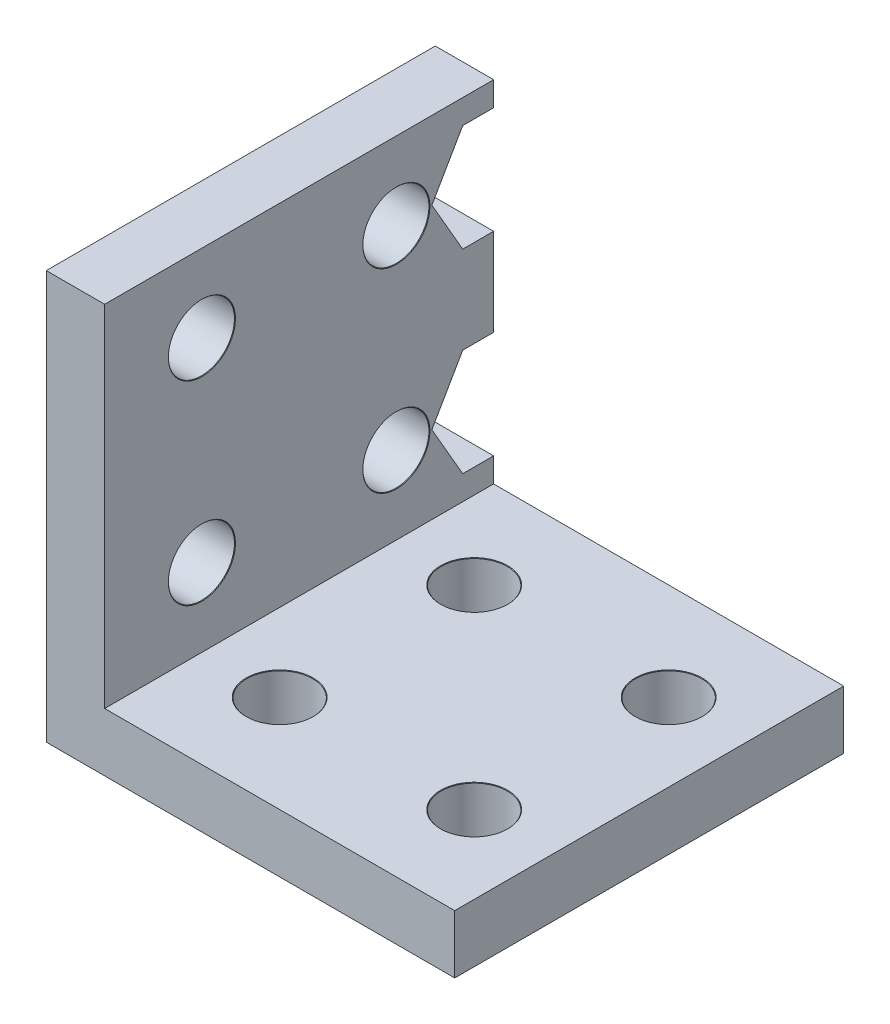
ISO-10303-21;
HEADER;
FILE_DESCRIPTION(('STEP AP214'),'2;1');
FILE_NAME('part.step','',(''),(''),'','','');
FILE_SCHEMA(('AUTOMOTIVE_DESIGN { 1 0 10303 214 1 1 1 1 }'));
ENDSEC;
DATA;
#1=APPLICATION_CONTEXT('core data for automotive mechanical design processes');
#2=APPLICATION_PROTOCOL_DEFINITION('international standard','automotive_design',2000,#1);
#3=PRODUCT_CONTEXT('',#1,'mechanical');
#4=PRODUCT('Part','Part','',(#3));
#5=PRODUCT_RELATED_PRODUCT_CATEGORY('part','',(#4));
#6=PRODUCT_DEFINITION_FORMATION('','',#4);
#7=PRODUCT_DEFINITION_CONTEXT('part definition',#1,'design');
#8=PRODUCT_DEFINITION('design','',#6,#7);
#9=PRODUCT_DEFINITION_SHAPE('','',#8);
#10=(LENGTH_UNIT() NAMED_UNIT(*) SI_UNIT(.MILLI.,.METRE.));
#11=(NAMED_UNIT(*) PLANE_ANGLE_UNIT() SI_UNIT($,.RADIAN.));
#12=(NAMED_UNIT(*) SI_UNIT($,.STERADIAN.) SOLID_ANGLE_UNIT());
#13=UNCERTAINTY_MEASURE_WITH_UNIT(LENGTH_MEASURE(1.E-05),#10,'distance_accuracy_value','');
#14=(GEOMETRIC_REPRESENTATION_CONTEXT(3) GLOBAL_UNCERTAINTY_ASSIGNED_CONTEXT((#13)) GLOBAL_UNIT_ASSIGNED_CONTEXT((#10,
#11,#12)) REPRESENTATION_CONTEXT('',''));
#15=CARTESIAN_POINT('',(0.,0.,0.));
#16=DIRECTION('',(0.,0.,1.));
#17=DIRECTION('',(1.,0.,0.));
#18=AXIS2_PLACEMENT_3D('',#15,#16,#17);
#19=CARTESIAN_POINT('',(0.,0.,0.));
#20=DIRECTION('',(0.,0.,1.));
#21=DIRECTION('',(1.,0.,0.));
#22=AXIS2_PLACEMENT_3D('',#19,#20,#21);
#23=PLANE('',#22);
#24=DIRECTION('',(0.,-1.,0.));
#25=VECTOR('',#24,1.);
#26=CARTESIAN_POINT('',(0.,21.,0.));
#27=LINE('',#26,#25);
#28=CARTESIAN_POINT('',(0.,4.24999999996839,0.));
#29=VERTEX_POINT('',#28);
#30=CARTESIAN_POINT('',(0.,0.,0.));
#31=VERTEX_POINT('',#30);
#32=EDGE_CURVE('E228',#29,#31,#27,.T.);
#33=ORIENTED_EDGE('',*,*,#32,.F.);
#34=DIRECTION('',(1.,0.,0.));
#35=VECTOR('',#34,1.);
#36=CARTESIAN_POINT('',(-6.3508529611243,4.24999999996839,0.));
#37=LINE('',#36,#35);
#38=CARTESIAN_POINT('',(3.,4.24999999996839,0.));
#39=VERTEX_POINT('',#38);
#40=EDGE_CURVE('E407',#29,#39,#37,.T.);
#41=ORIENTED_EDGE('',*,*,#40,.T.);
#42=DIRECTION('',(0.,1.,0.));
#43=VECTOR('',#42,1.);
#44=CARTESIAN_POINT('',(3.,3.,0.));
#45=LINE('',#44,#43);
#46=CARTESIAN_POINT('',(3.,3.,0.));
#47=VERTEX_POINT('',#46);
#48=EDGE_CURVE('E187',#47,#39,#45,.T.);
#49=ORIENTED_EDGE('',*,*,#48,.F.);
#50=DIRECTION('',(-1.,0.,0.));
#51=VECTOR('',#50,1.);
#52=CARTESIAN_POINT('',(21.,3.,0.));
#53=LINE('',#52,#51);
#54=CARTESIAN_POINT('',(21.,3.,0.));
#55=VERTEX_POINT('',#54);
#56=EDGE_CURVE('E193',#55,#47,#53,.T.);
#57=ORIENTED_EDGE('',*,*,#56,.F.);
#58=DIRECTION('',(0.,1.,0.));
#59=VECTOR('',#58,1.);
#60=CARTESIAN_POINT('',(21.,0.,0.));
#61=LINE('',#60,#59);
#62=CARTESIAN_POINT('',(21.,0.,0.));
#63=VERTEX_POINT('',#62);
#64=EDGE_CURVE('E230',#63,#55,#61,.T.);
#65=ORIENTED_EDGE('',*,*,#64,.F.);
#66=DIRECTION('',(1.,0.,0.));
#67=VECTOR('',#66,1.);
#68=CARTESIAN_POINT('',(0.,0.,0.));
#69=LINE('',#68,#67);
#70=EDGE_CURVE('E221',#31,#63,#69,.T.);
#71=ORIENTED_EDGE('',*,*,#70,.F.);
#72=EDGE_LOOP('',(#33,#41,#49,#57,#65,#71));
#73=FACE_BOUND('',#72,.T.);
#74=ADVANCED_FACE('F45',(#73),#23,.F.);
#75=CARTESIAN_POINT('',(3.,9.74999999996839,0.));
#76=VERTEX_POINT('',#75);
#77=CARTESIAN_POINT('',(3.,14.2499999999684,0.));
#78=VERTEX_POINT('',#77);
#79=EDGE_CURVE('E177',#76,#78,#45,.T.);
#80=ORIENTED_EDGE('',*,*,#79,.F.);
#81=DIRECTION('',(1.,0.,0.));
#82=VECTOR('',#81,1.);
#83=CARTESIAN_POINT('',(-6.3508529611243,9.74999999996839,0.));
#84=LINE('',#83,#82);
#85=CARTESIAN_POINT('',(0.,9.74999999996839,0.));
#86=VERTEX_POINT('',#85);
#87=EDGE_CURVE('E159',#86,#76,#84,.T.);
#88=ORIENTED_EDGE('',*,*,#87,.F.);
#89=CARTESIAN_POINT('',(0.,14.2499999999684,0.));
#90=VERTEX_POINT('',#89);
#91=EDGE_CURVE('E237',#90,#86,#27,.T.);
#92=ORIENTED_EDGE('',*,*,#91,.F.);
#93=DIRECTION('',(1.,0.,0.));
#94=VECTOR('',#93,1.);
#95=CARTESIAN_POINT('',(-6.3508529611243,14.2499999999684,0.));
#96=LINE('',#95,#94);
#97=EDGE_CURVE('E185',#90,#78,#96,.T.);
#98=ORIENTED_EDGE('',*,*,#97,.T.);
#99=EDGE_LOOP('',(#80,#88,#92,#98));
#100=FACE_BOUND('',#99,.T.);
#101=ADVANCED_FACE('F184',(#100),#23,.F.);
#102=CARTESIAN_POINT('',(2.99999999999999,21.,20.));
#103=DIRECTION('',(0.,-1.,0.));
#104=DIRECTION('',(0.,0.,-1.));
#105=AXIS2_PLACEMENT_3D('',#102,#103,#104);
#106=PLANE('',#105);
#107=DIRECTION('',(-1.,0.,0.));
#108=VECTOR('',#107,1.);
#109=CARTESIAN_POINT('',(2.99999999999999,21.,0.));
#110=LINE('',#109,#108);
#111=CARTESIAN_POINT('',(2.99999999999999,21.,0.));
#112=VERTEX_POINT('',#111);
#113=CARTESIAN_POINT('',(0.,21.,0.));
#114=VERTEX_POINT('',#113);
#115=EDGE_CURVE('E240',#112,#114,#110,.T.);
#116=ORIENTED_EDGE('',*,*,#115,.T.);
#117=DIRECTION('',(0.,0.,-1.));
#118=VECTOR('',#117,1.);
#119=CARTESIAN_POINT('',(0.,21.,20.));
#120=LINE('',#119,#118);
#121=CARTESIAN_POINT('',(0.,21.,20.));
#122=VERTEX_POINT('',#121);
#123=EDGE_CURVE('E11',#122,#114,#120,.T.);
#124=ORIENTED_EDGE('',*,*,#123,.F.);
#125=DIRECTION('',(-1.,0.,0.));
#126=VECTOR('',#125,1.);
#127=CARTESIAN_POINT('',(2.99999999999999,21.,20.));
#128=LINE('',#127,#126);
#129=CARTESIAN_POINT('',(2.99999999999999,21.,20.));
#130=VERTEX_POINT('',#129);
#131=EDGE_CURVE('E192',#130,#122,#128,.T.);
#132=ORIENTED_EDGE('',*,*,#131,.F.);
#133=DIRECTION('',(0.,0.,-1.));
#134=VECTOR('',#133,1.);
#135=CARTESIAN_POINT('',(2.99999999999999,21.,20.));
#136=LINE('',#135,#134);
#137=EDGE_CURVE('E197',#130,#112,#136,.T.);
#138=ORIENTED_EDGE('',*,*,#137,.T.);
#139=EDGE_LOOP('',(#116,#124,#132,#138));
#140=FACE_BOUND('',#139,.T.);
#141=ADVANCED_FACE('F47',(#140),#106,.F.);
#142=CARTESIAN_POINT('',(0.,21.,20.));
#143=DIRECTION('',(1.,0.,0.));
#144=DIRECTION('',(0.,1.,0.));
#145=AXIS2_PLACEMENT_3D('',#142,#143,#144);
#146=PLANE('',#145);
#147=CARTESIAN_POINT('',(0.,7.,15.));
#148=DIRECTION('',(1.,0.,0.));
#149=DIRECTION('',(0.,0.,-1.));
#150=AXIS2_PLACEMENT_3D('',#147,#148,#149);
#151=CIRCLE('',#150,1.7);
#152=CARTESIAN_POINT('',(0.,7.,13.3));
#153=VERTEX_POINT('',#152);
#154=EDGE_CURVE('E344',#153,#153,#151,.T.);
#155=ORIENTED_EDGE('',*,*,#154,.T.);
#156=EDGE_LOOP('',(#155));
#157=FACE_BOUND('',#156,.T.);
#158=CARTESIAN_POINT('',(0.,7.,5.));
#159=DIRECTION('',(1.,0.,0.));
#160=DIRECTION('',(0.,0.,-1.));
#161=AXIS2_PLACEMENT_3D('',#158,#159,#160);
#162=CIRCLE('',#161,1.7);
#163=CARTESIAN_POINT('',(0.,7.,3.3));
#164=VERTEX_POINT('',#163);
#165=EDGE_CURVE('E332',#164,#164,#162,.T.);
#166=ORIENTED_EDGE('',*,*,#165,.T.);
#167=EDGE_LOOP('',(#166));
#168=FACE_BOUND('',#167,.T.);
#169=CARTESIAN_POINT('',(0.,17.,5.));
#170=DIRECTION('',(1.,0.,0.));
#171=DIRECTION('',(0.,0.,-1.));
#172=AXIS2_PLACEMENT_3D('',#169,#170,#171);
#173=CIRCLE('',#172,1.7);
#174=CARTESIAN_POINT('',(0.,17.,3.3));
#175=VERTEX_POINT('',#174);
#176=EDGE_CURVE('E320',#175,#175,#173,.T.);
#177=ORIENTED_EDGE('',*,*,#176,.T.);
#178=EDGE_LOOP('',(#177));
#179=FACE_BOUND('',#178,.T.);
#180=CARTESIAN_POINT('',(0.,17.,15.));
#181=DIRECTION('',(1.,0.,0.));
#182=DIRECTION('',(0.,0.,-1.));
#183=AXIS2_PLACEMENT_3D('',#180,#181,#182);
#184=CIRCLE('',#183,1.7);
#185=CARTESIAN_POINT('',(0.,17.,13.3));
#186=VERTEX_POINT('',#185);
#187=EDGE_CURVE('E308',#186,#186,#184,.T.);
#188=ORIENTED_EDGE('',*,*,#187,.T.);
#189=EDGE_LOOP('',(#188));
#190=FACE_BOUND('',#189,.T.);
#191=DIRECTION('',(0.,0.866025403784439,0.5));
#192=VECTOR('',#191,1.);
#193=CARTESIAN_POINT('',(0.,0.374999999960671,-0.649519052770208));
#194=LINE('',#193,#192);
#195=CARTESIAN_POINT('',(0.,4.24999999996839,1.58771324034405));
#196=VERTEX_POINT('',#195);
#197=CARTESIAN_POINT('',(0.,6.99999999996839,3.17542648061552));
#198=VERTEX_POINT('',#197);
#199=EDGE_CURVE('E421',#196,#198,#194,.T.);
#200=ORIENTED_EDGE('',*,*,#199,.F.);
#201=DIRECTION('',(0.,0.,1.));
#202=VECTOR('',#201,1.);
#203=CARTESIAN_POINT('',(0.,4.24999999996839,0.));
#204=LINE('',#203,#202);
#205=EDGE_CURVE('E397',#29,#196,#204,.T.);
#206=ORIENTED_EDGE('',*,*,#205,.F.);
#207=ORIENTED_EDGE('',*,*,#32,.T.);
#208=DIRECTION('',(0.,0.,-1.));
#209=VECTOR('',#208,1.);
#210=CARTESIAN_POINT('',(0.,0.,20.));
#211=LINE('',#210,#209);
#212=CARTESIAN_POINT('',(0.,0.,20.));
#213=VERTEX_POINT('',#212);
#214=EDGE_CURVE('E54',#213,#31,#211,.T.);
#215=ORIENTED_EDGE('',*,*,#214,.F.);
#216=DIRECTION('',(0.,-1.,0.));
#217=VECTOR('',#216,1.);
#218=CARTESIAN_POINT('',(0.,21.,20.));
#219=LINE('',#218,#217);
#220=EDGE_CURVE('E255',#122,#213,#219,.T.);
#221=ORIENTED_EDGE('',*,*,#220,.F.);
#222=ORIENTED_EDGE('',*,*,#123,.T.);
#223=CARTESIAN_POINT('',(0.,19.7499999999684,0.));
#224=VERTEX_POINT('',#223);
#225=EDGE_CURVE('E232',#114,#224,#27,.T.);
#226=ORIENTED_EDGE('',*,*,#225,.T.);
#227=DIRECTION('',(0.,0.,-1.));
#228=VECTOR('',#227,1.);
#229=CARTESIAN_POINT('',(0.,19.7499999999684,0.));
#230=LINE('',#229,#228);
#231=CARTESIAN_POINT('',(0.,19.7499999999684,1.5877132403483));
#232=VERTEX_POINT('',#231);
#233=EDGE_CURVE('E69',#232,#224,#230,.T.);
#234=ORIENTED_EDGE('',*,*,#233,.F.);
#235=DIRECTION('',(0.,0.866025403784439,-0.5));
#236=VECTOR('',#235,1.);
#237=CARTESIAN_POINT('',(0.,5.62500000002536,9.74278579261887));
#238=LINE('',#237,#236);
#239=CARTESIAN_POINT('',(0.,16.9999999999684,3.17542648061977));
#240=VERTEX_POINT('',#239);
#241=EDGE_CURVE('E374',#240,#232,#238,.T.);
#242=ORIENTED_EDGE('',*,*,#241,.F.);
#243=DIRECTION('',(0.,0.866025403784438,0.500000000000001));
#244=VECTOR('',#243,1.);
#245=CARTESIAN_POINT('',(0.,2.87499999995884,-4.97964607168923));
#246=LINE('',#245,#244);
#247=CARTESIAN_POINT('',(0.,14.2499999999684,1.5877132403483));
#248=VERTEX_POINT('',#247);
#249=EDGE_CURVE('E391',#248,#240,#246,.T.);
#250=ORIENTED_EDGE('',*,*,#249,.F.);
#251=DIRECTION('',(0.,0.,1.));
#252=VECTOR('',#251,1.);
#253=CARTESIAN_POINT('',(0.,14.2499999999684,0.));
#254=LINE('',#253,#252);
#255=EDGE_CURVE('E358',#90,#248,#254,.T.);
#256=ORIENTED_EDGE('',*,*,#255,.F.);
#257=ORIENTED_EDGE('',*,*,#91,.T.);
#258=DIRECTION('',(0.,0.,-1.));
#259=VECTOR('',#258,1.);
#260=CARTESIAN_POINT('',(0.,9.74999999996839,0.));
#261=LINE('',#260,#259);
#262=CARTESIAN_POINT('',(0.,9.74999999996839,1.58771324034405));
#263=VERTEX_POINT('',#262);
#264=EDGE_CURVE('E61',#263,#86,#261,.T.);
#265=ORIENTED_EDGE('',*,*,#264,.F.);
#266=DIRECTION('',(0.,0.866025403784439,-0.5));
#267=VECTOR('',#266,1.);
#268=CARTESIAN_POINT('',(0.,3.12500000002352,5.41265877369349));
#269=LINE('',#268,#267);
#270=EDGE_CURVE('E410',#198,#263,#269,.T.);
#271=ORIENTED_EDGE('',*,*,#270,.F.);
#272=EDGE_LOOP('',(#200,#206,#207,#215,#221,#222,#226,#234,#242,#250,#256,#257,#265,#271));
#273=FACE_BOUND('',#272,.T.);
#274=ADVANCED_FACE('F430',(#157,#168,#179,#190,#273),#146,.F.);
#275=CARTESIAN_POINT('',(0.,0.,20.));
#276=DIRECTION('',(0.,1.,0.));
#277=DIRECTION('',(0.,0.,1.));
#278=AXIS2_PLACEMENT_3D('',#275,#276,#277);
#279=PLANE('',#278);
#280=CARTESIAN_POINT('',(7.,0.,5.));
#281=DIRECTION('',(0.,1.,0.));
#282=DIRECTION('',(0.,0.,1.));
#283=AXIS2_PLACEMENT_3D('',#280,#281,#282);
#284=CIRCLE('',#283,1.7);
#285=CARTESIAN_POINT('',(7.,0.,6.7));
#286=VERTEX_POINT('',#285);
#287=EDGE_CURVE('E296',#286,#286,#284,.T.);
#288=ORIENTED_EDGE('',*,*,#287,.T.);
#289=EDGE_LOOP('',(#288));
#290=FACE_BOUND('',#289,.T.);
#291=CARTESIAN_POINT('',(17.,0.,5.));
#292=DIRECTION('',(0.,1.,0.));
#293=DIRECTION('',(0.,0.,1.));
#294=AXIS2_PLACEMENT_3D('',#291,#292,#293);
#295=CIRCLE('',#294,1.7);
#296=CARTESIAN_POINT('',(17.,0.,6.7));
#297=VERTEX_POINT('',#296);
#298=EDGE_CURVE('E284',#297,#297,#295,.T.);
#299=ORIENTED_EDGE('',*,*,#298,.T.);
#300=EDGE_LOOP('',(#299));
#301=FACE_BOUND('',#300,.T.);
#302=CARTESIAN_POINT('',(17.,0.,15.));
#303=DIRECTION('',(0.,1.,0.));
#304=DIRECTION('',(0.,0.,1.));
#305=AXIS2_PLACEMENT_3D('',#302,#303,#304);
#306=CIRCLE('',#305,1.7);
#307=CARTESIAN_POINT('',(17.,0.,16.7));
#308=VERTEX_POINT('',#307);
#309=EDGE_CURVE('E272',#308,#308,#306,.T.);
#310=ORIENTED_EDGE('',*,*,#309,.T.);
#311=EDGE_LOOP('',(#310));
#312=FACE_BOUND('',#311,.T.);
#313=CARTESIAN_POINT('',(7.,0.,15.));
#314=DIRECTION('',(0.,1.,0.));
#315=DIRECTION('',(0.,0.,1.));
#316=AXIS2_PLACEMENT_3D('',#313,#314,#315);
#317=CIRCLE('',#316,1.7);
#318=CARTESIAN_POINT('',(7.,0.,16.7));
#319=VERTEX_POINT('',#318);
#320=EDGE_CURVE('E244',#319,#319,#317,.T.);
#321=ORIENTED_EDGE('',*,*,#320,.T.);
#322=EDGE_LOOP('',(#321));
#323=FACE_BOUND('',#322,.T.);
#324=ORIENTED_EDGE('',*,*,#70,.T.);
#325=DIRECTION('',(0.,0.,-1.));
#326=VECTOR('',#325,1.);
#327=CARTESIAN_POINT('',(21.,0.,20.));
#328=LINE('',#327,#326);
#329=CARTESIAN_POINT('',(21.,0.,20.));
#330=VERTEX_POINT('',#329);
#331=EDGE_CURVE('E210',#330,#63,#328,.T.);
#332=ORIENTED_EDGE('',*,*,#331,.F.);
#333=DIRECTION('',(1.,0.,0.));
#334=VECTOR('',#333,1.);
#335=CARTESIAN_POINT('',(0.,0.,20.));
#336=LINE('',#335,#334);
#337=EDGE_CURVE('E222',#213,#330,#336,.T.);
#338=ORIENTED_EDGE('',*,*,#337,.F.);
#339=ORIENTED_EDGE('',*,*,#214,.T.);
#340=EDGE_LOOP('',(#324,#332,#338,#339));
#341=FACE_BOUND('',#340,.T.);
#342=ADVANCED_FACE('F219',(#290,#301,#312,#323,#341),#279,.F.);
#343=CARTESIAN_POINT('',(21.,0.,20.));
#344=DIRECTION('',(-1.,0.,0.));
#345=DIRECTION('',(0.,0.,1.));
#346=AXIS2_PLACEMENT_3D('',#343,#344,#345);
#347=PLANE('',#346);
#348=ORIENTED_EDGE('',*,*,#64,.T.);
#349=DIRECTION('',(0.,0.,-1.));
#350=VECTOR('',#349,1.);
#351=CARTESIAN_POINT('',(21.,3.,20.));
#352=LINE('',#351,#350);
#353=CARTESIAN_POINT('',(21.,3.,20.));
#354=VERTEX_POINT('',#353);
#355=EDGE_CURVE('E206',#354,#55,#352,.T.);
#356=ORIENTED_EDGE('',*,*,#355,.F.);
#357=DIRECTION('',(0.,1.,0.));
#358=VECTOR('',#357,1.);
#359=CARTESIAN_POINT('',(21.,0.,20.));
#360=LINE('',#359,#358);
#361=EDGE_CURVE('E250',#330,#354,#360,.T.);
#362=ORIENTED_EDGE('',*,*,#361,.F.);
#363=ORIENTED_EDGE('',*,*,#331,.T.);
#364=EDGE_LOOP('',(#348,#356,#362,#363));
#365=FACE_BOUND('',#364,.T.);
#366=ADVANCED_FACE('F457',(#365),#347,.F.);
#367=CARTESIAN_POINT('',(21.,3.,20.));
#368=DIRECTION('',(0.,-1.,0.));
#369=DIRECTION('',(1.,0.,0.));
#370=AXIS2_PLACEMENT_3D('',#367,#368,#369);
#371=PLANE('',#370);
#372=CARTESIAN_POINT('',(7.,3.,5.));
#373=DIRECTION('',(0.,1.,0.));
#374=DIRECTION('',(0.,0.,1.));
#375=AXIS2_PLACEMENT_3D('',#372,#373,#374);
#376=CIRCLE('',#375,1.725);
#377=CARTESIAN_POINT('',(7.,3.,6.725));
#378=VERTEX_POINT('',#377);
#379=EDGE_CURVE('E304',#378,#378,#376,.T.);
#380=ORIENTED_EDGE('',*,*,#379,.F.);
#381=EDGE_LOOP('',(#380));
#382=FACE_BOUND('',#381,.T.);
#383=CARTESIAN_POINT('',(17.,3.,5.));
#384=DIRECTION('',(0.,1.,0.));
#385=DIRECTION('',(0.,0.,1.));
#386=AXIS2_PLACEMENT_3D('',#383,#384,#385);
#387=CIRCLE('',#386,1.725);
#388=CARTESIAN_POINT('',(17.,3.,6.725));
#389=VERTEX_POINT('',#388);
#390=EDGE_CURVE('E292',#389,#389,#387,.T.);
#391=ORIENTED_EDGE('',*,*,#390,.F.);
#392=EDGE_LOOP('',(#391));
#393=FACE_BOUND('',#392,.T.);
#394=CARTESIAN_POINT('',(17.,3.,15.));
#395=DIRECTION('',(0.,1.,0.));
#396=DIRECTION('',(0.,0.,1.));
#397=AXIS2_PLACEMENT_3D('',#394,#395,#396);
#398=CIRCLE('',#397,1.725);
#399=CARTESIAN_POINT('',(17.,3.,16.725));
#400=VERTEX_POINT('',#399);
#401=EDGE_CURVE('E280',#400,#400,#398,.T.);
#402=ORIENTED_EDGE('',*,*,#401,.F.);
#403=EDGE_LOOP('',(#402));
#404=FACE_BOUND('',#403,.T.);
#405=CARTESIAN_POINT('',(7.,3.,15.));
#406=DIRECTION('',(0.,1.,0.));
#407=DIRECTION('',(0.,0.,1.));
#408=AXIS2_PLACEMENT_3D('',#405,#406,#407);
#409=CIRCLE('',#408,1.725);
#410=CARTESIAN_POINT('',(7.,3.,16.725));
#411=VERTEX_POINT('',#410);
#412=EDGE_CURVE('E268',#411,#411,#409,.T.);
#413=ORIENTED_EDGE('',*,*,#412,.F.);
#414=EDGE_LOOP('',(#413));
#415=FACE_BOUND('',#414,.T.);
#416=ORIENTED_EDGE('',*,*,#56,.T.);
#417=DIRECTION('',(0.,0.,-1.));
#418=VECTOR('',#417,1.);
#419=CARTESIAN_POINT('',(3.,3.,20.));
#420=LINE('',#419,#418);
#421=CARTESIAN_POINT('',(3.,3.,20.));
#422=VERTEX_POINT('',#421);
#423=EDGE_CURVE('E201',#422,#47,#420,.T.);
#424=ORIENTED_EDGE('',*,*,#423,.F.);
#425=DIRECTION('',(-1.,0.,0.));
#426=VECTOR('',#425,1.);
#427=CARTESIAN_POINT('',(21.,3.,20.));
#428=LINE('',#427,#426);
#429=EDGE_CURVE('E247',#354,#422,#428,.T.);
#430=ORIENTED_EDGE('',*,*,#429,.F.);
#431=ORIENTED_EDGE('',*,*,#355,.T.);
#432=EDGE_LOOP('',(#416,#424,#430,#431));
#433=FACE_BOUND('',#432,.T.);
#434=ADVANCED_FACE('F446',(#382,#393,#404,#415,#433),#371,.F.);
#435=CARTESIAN_POINT('',(3.,3.,20.));
#436=DIRECTION('',(-1.,0.,0.));
#437=DIRECTION('',(0.,-1.,0.));
#438=AXIS2_PLACEMENT_3D('',#435,#436,#437);
#439=PLANE('',#438);
#440=CARTESIAN_POINT('',(3.,7.,15.));
#441=DIRECTION('',(1.,0.,0.));
#442=DIRECTION('',(0.,0.,-1.));
#443=AXIS2_PLACEMENT_3D('',#440,#441,#442);
#444=CIRCLE('',#443,1.725);
#445=CARTESIAN_POINT('',(3.,7.,13.275));
#446=VERTEX_POINT('',#445);
#447=EDGE_CURVE('E352',#446,#446,#444,.T.);
#448=ORIENTED_EDGE('',*,*,#447,.F.);
#449=EDGE_LOOP('',(#448));
#450=FACE_BOUND('',#449,.T.);
#451=CARTESIAN_POINT('',(3.,7.,5.));
#452=DIRECTION('',(1.,0.,0.));
#453=DIRECTION('',(0.,0.,-1.));
#454=AXIS2_PLACEMENT_3D('',#451,#452,#453);
#455=CIRCLE('',#454,1.725);
#456=CARTESIAN_POINT('',(3.,7.,3.275));
#457=VERTEX_POINT('',#456);
#458=EDGE_CURVE('E340',#457,#457,#455,.T.);
#459=ORIENTED_EDGE('',*,*,#458,.F.);
#460=EDGE_LOOP('',(#459));
#461=FACE_BOUND('',#460,.T.);
#462=CARTESIAN_POINT('',(3.,17.,5.));
#463=DIRECTION('',(1.,0.,0.));
#464=DIRECTION('',(0.,0.,-1.));
#465=AXIS2_PLACEMENT_3D('',#462,#463,#464);
#466=CIRCLE('',#465,1.725);
#467=CARTESIAN_POINT('',(3.,17.,3.275));
#468=VERTEX_POINT('',#467);
#469=EDGE_CURVE('E328',#468,#468,#466,.T.);
#470=ORIENTED_EDGE('',*,*,#469,.F.);
#471=EDGE_LOOP('',(#470));
#472=FACE_BOUND('',#471,.T.);
#473=CARTESIAN_POINT('',(3.,17.,15.));
#474=DIRECTION('',(1.,0.,0.));
#475=DIRECTION('',(0.,0.,-1.));
#476=AXIS2_PLACEMENT_3D('',#473,#474,#475);
#477=CIRCLE('',#476,1.725);
#478=CARTESIAN_POINT('',(3.,17.,13.275));
#479=VERTEX_POINT('',#478);
#480=EDGE_CURVE('E316',#479,#479,#477,.T.);
#481=ORIENTED_EDGE('',*,*,#480,.F.);
#482=EDGE_LOOP('',(#481));
#483=FACE_BOUND('',#482,.T.);
#484=ORIENTED_EDGE('',*,*,#48,.T.);
#485=DIRECTION('',(0.,0.,-1.));
#486=VECTOR('',#485,1.);
#487=CARTESIAN_POINT('',(3.,4.24999999996839,0.));
#488=LINE('',#487,#486);
#489=CARTESIAN_POINT('',(3.,4.24999999996839,1.58771324034405));
#490=VERTEX_POINT('',#489);
#491=EDGE_CURVE('E170',#490,#39,#488,.T.);
#492=ORIENTED_EDGE('',*,*,#491,.F.);
#493=DIRECTION('',(0.,-0.866025403784439,-0.5));
#494=VECTOR('',#493,1.);
#495=CARTESIAN_POINT('',(3.,0.374999999960672,-0.649519052770208));
#496=LINE('',#495,#494);
#497=CARTESIAN_POINT('',(3.,6.99999999996839,3.17542648061552));
#498=VERTEX_POINT('',#497);
#499=EDGE_CURVE('E413',#498,#490,#496,.T.);
#500=ORIENTED_EDGE('',*,*,#499,.F.);
#501=DIRECTION('',(0.,-0.866025403784439,0.5));
#502=VECTOR('',#501,1.);
#503=CARTESIAN_POINT('',(3.,3.12500000002352,5.41265877369349));
#504=LINE('',#503,#502);
#505=CARTESIAN_POINT('',(3.,9.74999999996839,1.58771324034405));
#506=VERTEX_POINT('',#505);
#507=EDGE_CURVE('E180',#506,#498,#504,.T.);
#508=ORIENTED_EDGE('',*,*,#507,.F.);
#509=DIRECTION('',(0.,0.,1.));
#510=VECTOR('',#509,1.);
#511=CARTESIAN_POINT('',(3.,9.74999999996839,0.));
#512=LINE('',#511,#510);
#513=EDGE_CURVE('E162',#76,#506,#512,.T.);
#514=ORIENTED_EDGE('',*,*,#513,.F.);
#515=ORIENTED_EDGE('',*,*,#79,.T.);
#516=DIRECTION('',(0.,0.,-1.));
#517=VECTOR('',#516,1.);
#518=CARTESIAN_POINT('',(3.,14.2499999999684,0.));
#519=LINE('',#518,#517);
#520=CARTESIAN_POINT('',(3.,14.2499999999684,1.5877132403483));
#521=VERTEX_POINT('',#520);
#522=EDGE_CURVE('E363',#521,#78,#519,.T.);
#523=ORIENTED_EDGE('',*,*,#522,.F.);
#524=DIRECTION('',(0.,-0.866025403784438,-0.500000000000001));
#525=VECTOR('',#524,1.);
#526=CARTESIAN_POINT('',(3.,2.87499999995884,-4.97964607168923));
#527=LINE('',#526,#525);
#528=CARTESIAN_POINT('',(2.99999999999999,16.9999999999684,3.17542648061977));
#529=VERTEX_POINT('',#528);
#530=EDGE_CURVE('E377',#529,#521,#527,.T.);
#531=ORIENTED_EDGE('',*,*,#530,.F.);
#532=DIRECTION('',(0.,-0.866025403784439,0.5));
#533=VECTOR('',#532,1.);
#534=CARTESIAN_POINT('',(3.,5.62500000002536,9.74278579261887));
#535=LINE('',#534,#533);
#536=CARTESIAN_POINT('',(2.99999999999999,19.7499999999684,1.5877132403483));
#537=VERTEX_POINT('',#536);
#538=EDGE_CURVE('E381',#537,#529,#535,.T.);
#539=ORIENTED_EDGE('',*,*,#538,.F.);
#540=DIRECTION('',(0.,0.,1.));
#541=VECTOR('',#540,1.);
#542=CARTESIAN_POINT('',(2.99999999999999,19.7499999999684,0.));
#543=LINE('',#542,#541);
#544=CARTESIAN_POINT('',(2.99999999999999,19.7499999999684,0.));
#545=VERTEX_POINT('',#544);
#546=EDGE_CURVE('E385',#545,#537,#543,.T.);
#547=ORIENTED_EDGE('',*,*,#546,.F.);
#548=EDGE_CURVE('E188',#545,#112,#45,.T.);
#549=ORIENTED_EDGE('',*,*,#548,.T.);
#550=ORIENTED_EDGE('',*,*,#137,.F.);
#551=DIRECTION('',(0.,1.,0.));
#552=VECTOR('',#551,1.);
#553=CARTESIAN_POINT('',(3.,3.,20.));
#554=LINE('',#553,#552);
#555=EDGE_CURVE('E202',#422,#130,#554,.T.);
#556=ORIENTED_EDGE('',*,*,#555,.F.);
#557=ORIENTED_EDGE('',*,*,#423,.T.);
#558=EDGE_LOOP('',(#484,#492,#500,#508,#514,#515,#523,#531,#539,#547,#549,#550,#556,#557));
#559=FACE_BOUND('',#558,.T.);
#560=ADVANCED_FACE('F175',(#450,#461,#472,#483,#559),#439,.F.);
#561=CARTESIAN_POINT('',(0.,0.,20.));
#562=DIRECTION('',(0.,0.,1.));
#563=DIRECTION('',(1.,0.,0.));
#564=AXIS2_PLACEMENT_3D('',#561,#562,#563);
#565=PLANE('',#564);
#566=ORIENTED_EDGE('',*,*,#131,.T.);
#567=ORIENTED_EDGE('',*,*,#220,.T.);
#568=ORIENTED_EDGE('',*,*,#337,.T.);
#569=ORIENTED_EDGE('',*,*,#361,.T.);
#570=ORIENTED_EDGE('',*,*,#429,.T.);
#571=ORIENTED_EDGE('',*,*,#555,.T.);
#572=EDGE_LOOP('',(#566,#567,#568,#569,#570,#571));
#573=FACE_BOUND('',#572,.T.);
#574=ADVANCED_FACE('F453',(#573),#565,.T.);
#575=ORIENTED_EDGE('',*,*,#548,.F.);
#576=DIRECTION('',(1.,0.,0.));
#577=VECTOR('',#576,1.);
#578=CARTESIAN_POINT('',(-6.3508529611243,19.7499999999684,0.));
#579=LINE('',#578,#577);
#580=EDGE_CURVE('E359',#224,#545,#579,.T.);
#581=ORIENTED_EDGE('',*,*,#580,.F.);
#582=ORIENTED_EDGE('',*,*,#225,.F.);
#583=ORIENTED_EDGE('',*,*,#115,.F.);
#584=EDGE_LOOP('',(#575,#581,#582,#583));
#585=FACE_BOUND('',#584,.T.);
#586=ADVANCED_FACE('F472',(#585),#23,.F.);
#587=CARTESIAN_POINT('',(7.,3.,15.));
#588=DIRECTION('',(0.,1.,0.));
#589=DIRECTION('',(0.,0.,1.));
#590=AXIS2_PLACEMENT_3D('',#587,#588,#589);
#591=CYLINDRICAL_SURFACE('',#590,1.7);
#592=ORIENTED_EDGE('',*,*,#320,.F.);
#593=EDGE_LOOP('',(#592));
#594=FACE_BOUND('',#593,.T.);
#595=CARTESIAN_POINT('',(7.,2.975,15.));
#596=DIRECTION('',(0.,1.,0.));
#597=DIRECTION('',(0.,0.,1.));
#598=AXIS2_PLACEMENT_3D('',#595,#596,#597);
#599=CIRCLE('',#598,1.7);
#600=CARTESIAN_POINT('',(7.,2.975,16.7));
#601=VERTEX_POINT('',#600);
#602=EDGE_CURVE('E264',#601,#601,#599,.T.);
#603=ORIENTED_EDGE('',*,*,#602,.T.);
#604=EDGE_LOOP('',(#603));
#605=FACE_BOUND('',#604,.T.);
#606=ADVANCED_FACE('F480',(#594,#605),#591,.F.);
#607=CARTESIAN_POINT('',(7.,3.,15.));
#608=DIRECTION('',(0.,1.,0.));
#609=DIRECTION('',(0.,0.,1.));
#610=AXIS2_PLACEMENT_3D('',#607,#608,#609);
#611=CONICAL_SURFACE('',#610,1.725,0.785398163397414);
#612=ORIENTED_EDGE('',*,*,#602,.F.);
#613=EDGE_LOOP('',(#612));
#614=FACE_BOUND('',#613,.T.);
#615=ORIENTED_EDGE('',*,*,#412,.T.);
#616=EDGE_LOOP('',(#615));
#617=FACE_BOUND('',#616,.T.);
#618=ADVANCED_FACE('F487',(#614,#617),#611,.F.);
#619=CARTESIAN_POINT('',(17.,3.,15.));
#620=DIRECTION('',(0.,1.,0.));
#621=DIRECTION('',(0.,0.,1.));
#622=AXIS2_PLACEMENT_3D('',#619,#620,#621);
#623=CYLINDRICAL_SURFACE('',#622,1.7);
#624=ORIENTED_EDGE('',*,*,#309,.F.);
#625=EDGE_LOOP('',(#624));
#626=FACE_BOUND('',#625,.T.);
#627=CARTESIAN_POINT('',(17.,2.975,15.));
#628=DIRECTION('',(0.,1.,0.));
#629=DIRECTION('',(0.,0.,1.));
#630=AXIS2_PLACEMENT_3D('',#627,#628,#629);
#631=CIRCLE('',#630,1.7);
#632=CARTESIAN_POINT('',(17.,2.975,16.7));
#633=VERTEX_POINT('',#632);
#634=EDGE_CURVE('E276',#633,#633,#631,.T.);
#635=ORIENTED_EDGE('',*,*,#634,.T.);
#636=EDGE_LOOP('',(#635));
#637=FACE_BOUND('',#636,.T.);
#638=ADVANCED_FACE('F568',(#626,#637),#623,.F.);
#639=CARTESIAN_POINT('',(17.,3.,15.));
#640=DIRECTION('',(0.,1.,0.));
#641=DIRECTION('',(0.,0.,1.));
#642=AXIS2_PLACEMENT_3D('',#639,#640,#641);
#643=CONICAL_SURFACE('',#642,1.725,0.785398163397414);
#644=ORIENTED_EDGE('',*,*,#634,.F.);
#645=EDGE_LOOP('',(#644));
#646=FACE_BOUND('',#645,.T.);
#647=ORIENTED_EDGE('',*,*,#401,.T.);
#648=EDGE_LOOP('',(#647));
#649=FACE_BOUND('',#648,.T.);
#650=ADVANCED_FACE('F564',(#646,#649),#643,.F.);
#651=CARTESIAN_POINT('',(17.,3.,5.));
#652=DIRECTION('',(0.,1.,0.));
#653=DIRECTION('',(0.,0.,1.));
#654=AXIS2_PLACEMENT_3D('',#651,#652,#653);
#655=CYLINDRICAL_SURFACE('',#654,1.7);
#656=ORIENTED_EDGE('',*,*,#298,.F.);
#657=EDGE_LOOP('',(#656));
#658=FACE_BOUND('',#657,.T.);
#659=CARTESIAN_POINT('',(17.,2.975,5.));
#660=DIRECTION('',(0.,1.,0.));
#661=DIRECTION('',(0.,0.,1.));
#662=AXIS2_PLACEMENT_3D('',#659,#660,#661);
#663=CIRCLE('',#662,1.7);
#664=CARTESIAN_POINT('',(17.,2.975,6.7));
#665=VERTEX_POINT('',#664);
#666=EDGE_CURVE('E288',#665,#665,#663,.T.);
#667=ORIENTED_EDGE('',*,*,#666,.T.);
#668=EDGE_LOOP('',(#667));
#669=FACE_BOUND('',#668,.T.);
#670=ADVANCED_FACE('F560',(#658,#669),#655,.F.);
#671=CARTESIAN_POINT('',(17.,3.,5.));
#672=DIRECTION('',(0.,1.,0.));
#673=DIRECTION('',(0.,0.,1.));
#674=AXIS2_PLACEMENT_3D('',#671,#672,#673);
#675=CONICAL_SURFACE('',#674,1.725,0.785398163397414);
#676=ORIENTED_EDGE('',*,*,#666,.F.);
#677=EDGE_LOOP('',(#676));
#678=FACE_BOUND('',#677,.T.);
#679=ORIENTED_EDGE('',*,*,#390,.T.);
#680=EDGE_LOOP('',(#679));
#681=FACE_BOUND('',#680,.T.);
#682=ADVANCED_FACE('F556',(#678,#681),#675,.F.);
#683=CARTESIAN_POINT('',(7.,3.,5.));
#684=DIRECTION('',(0.,1.,0.));
#685=DIRECTION('',(0.,0.,1.));
#686=AXIS2_PLACEMENT_3D('',#683,#684,#685);
#687=CYLINDRICAL_SURFACE('',#686,1.7);
#688=ORIENTED_EDGE('',*,*,#287,.F.);
#689=EDGE_LOOP('',(#688));
#690=FACE_BOUND('',#689,.T.);
#691=CARTESIAN_POINT('',(7.,2.975,5.));
#692=DIRECTION('',(0.,1.,0.));
#693=DIRECTION('',(0.,0.,1.));
#694=AXIS2_PLACEMENT_3D('',#691,#692,#693);
#695=CIRCLE('',#694,1.7);
#696=CARTESIAN_POINT('',(7.,2.975,6.7));
#697=VERTEX_POINT('',#696);
#698=EDGE_CURVE('E300',#697,#697,#695,.T.);
#699=ORIENTED_EDGE('',*,*,#698,.T.);
#700=EDGE_LOOP('',(#699));
#701=FACE_BOUND('',#700,.T.);
#702=ADVANCED_FACE('F552',(#690,#701),#687,.F.);
#703=CARTESIAN_POINT('',(7.,3.,5.));
#704=DIRECTION('',(0.,1.,0.));
#705=DIRECTION('',(0.,0.,1.));
#706=AXIS2_PLACEMENT_3D('',#703,#704,#705);
#707=CONICAL_SURFACE('',#706,1.725,0.785398163397448);
#708=ORIENTED_EDGE('',*,*,#698,.F.);
#709=EDGE_LOOP('',(#708));
#710=FACE_BOUND('',#709,.T.);
#711=ORIENTED_EDGE('',*,*,#379,.T.);
#712=EDGE_LOOP('',(#711));
#713=FACE_BOUND('',#712,.T.);
#714=ADVANCED_FACE('F548',(#710,#713),#707,.F.);
#715=CARTESIAN_POINT('',(3.,17.,15.));
#716=DIRECTION('',(1.,0.,0.));
#717=DIRECTION('',(0.,0.,-1.));
#718=AXIS2_PLACEMENT_3D('',#715,#716,#717);
#719=CYLINDRICAL_SURFACE('',#718,1.69999999999999);
#720=ORIENTED_EDGE('',*,*,#187,.F.);
#721=EDGE_LOOP('',(#720));
#722=FACE_BOUND('',#721,.T.);
#723=CARTESIAN_POINT('',(2.97499999999997,17.,15.));
#724=DIRECTION('',(1.,0.,0.));
#725=DIRECTION('',(0.,0.,-1.));
#726=AXIS2_PLACEMENT_3D('',#723,#724,#725);
#727=CIRCLE('',#726,1.69999999999999);
#728=CARTESIAN_POINT('',(2.97499999999997,17.,13.3));
#729=VERTEX_POINT('',#728);
#730=EDGE_CURVE('E312',#729,#729,#727,.T.);
#731=ORIENTED_EDGE('',*,*,#730,.T.);
#732=EDGE_LOOP('',(#731));
#733=FACE_BOUND('',#732,.T.);
#734=ADVANCED_FACE('F544',(#722,#733),#719,.F.);
#735=CARTESIAN_POINT('',(3.,17.,15.));
#736=DIRECTION('',(1.,0.,0.));
#737=DIRECTION('',(0.,0.,-1.));
#738=AXIS2_PLACEMENT_3D('',#735,#736,#737);
#739=CONICAL_SURFACE('',#738,1.725,0.785398163397136);
#740=ORIENTED_EDGE('',*,*,#730,.F.);
#741=EDGE_LOOP('',(#740));
#742=FACE_BOUND('',#741,.T.);
#743=ORIENTED_EDGE('',*,*,#480,.T.);
#744=EDGE_LOOP('',(#743));
#745=FACE_BOUND('',#744,.T.);
#746=ADVANCED_FACE('F540',(#742,#745),#739,.F.);
#747=CARTESIAN_POINT('',(3.,17.,5.));
#748=DIRECTION('',(1.,0.,0.));
#749=DIRECTION('',(0.,0.,-1.));
#750=AXIS2_PLACEMENT_3D('',#747,#748,#749);
#751=CYLINDRICAL_SURFACE('',#750,1.69999999999999);
#752=ORIENTED_EDGE('',*,*,#176,.F.);
#753=EDGE_LOOP('',(#752));
#754=FACE_BOUND('',#753,.T.);
#755=CARTESIAN_POINT('',(2.97499999999997,17.,5.));
#756=DIRECTION('',(1.,0.,0.));
#757=DIRECTION('',(0.,0.,-1.));
#758=AXIS2_PLACEMENT_3D('',#755,#756,#757);
#759=CIRCLE('',#758,1.69999999999999);
#760=CARTESIAN_POINT('',(2.97499999999997,17.,3.30000000000001));
#761=VERTEX_POINT('',#760);
#762=EDGE_CURVE('E324',#761,#761,#759,.T.);
#763=ORIENTED_EDGE('',*,*,#762,.T.);
#764=EDGE_LOOP('',(#763));
#765=FACE_BOUND('',#764,.T.);
#766=ADVANCED_FACE('F536',(#754,#765),#751,.F.);
#767=CARTESIAN_POINT('',(3.,17.,5.));
#768=DIRECTION('',(1.,0.,0.));
#769=DIRECTION('',(0.,0.,-1.));
#770=AXIS2_PLACEMENT_3D('',#767,#768,#769);
#771=CONICAL_SURFACE('',#770,1.725,0.785398163397136);
#772=ORIENTED_EDGE('',*,*,#762,.F.);
#773=EDGE_LOOP('',(#772));
#774=FACE_BOUND('',#773,.T.);
#775=ORIENTED_EDGE('',*,*,#469,.T.);
#776=EDGE_LOOP('',(#775));
#777=FACE_BOUND('',#776,.T.);
#778=ADVANCED_FACE('F532',(#774,#777),#771,.F.);
#779=CARTESIAN_POINT('',(3.,7.,5.));
#780=DIRECTION('',(1.,0.,0.));
#781=DIRECTION('',(0.,0.,-1.));
#782=AXIS2_PLACEMENT_3D('',#779,#780,#781);
#783=CYLINDRICAL_SURFACE('',#782,1.69999999999999);
#784=ORIENTED_EDGE('',*,*,#165,.F.);
#785=EDGE_LOOP('',(#784));
#786=FACE_BOUND('',#785,.T.);
#787=CARTESIAN_POINT('',(2.97499999999997,7.,5.));
#788=DIRECTION('',(1.,0.,0.));
#789=DIRECTION('',(0.,0.,-1.));
#790=AXIS2_PLACEMENT_3D('',#787,#788,#789);
#791=CIRCLE('',#790,1.69999999999999);
#792=CARTESIAN_POINT('',(2.97499999999997,7.,3.30000000000001));
#793=VERTEX_POINT('',#792);
#794=EDGE_CURVE('E336',#793,#793,#791,.T.);
#795=ORIENTED_EDGE('',*,*,#794,.T.);
#796=EDGE_LOOP('',(#795));
#797=FACE_BOUND('',#796,.T.);
#798=ADVANCED_FACE('F528',(#786,#797),#783,.F.);
#799=CARTESIAN_POINT('',(3.,7.,5.));
#800=DIRECTION('',(1.,0.,0.));
#801=DIRECTION('',(0.,0.,-1.));
#802=AXIS2_PLACEMENT_3D('',#799,#800,#801);
#803=CONICAL_SURFACE('',#802,1.725,0.785398163397136);
#804=ORIENTED_EDGE('',*,*,#794,.F.);
#805=EDGE_LOOP('',(#804));
#806=FACE_BOUND('',#805,.T.);
#807=ORIENTED_EDGE('',*,*,#458,.T.);
#808=EDGE_LOOP('',(#807));
#809=FACE_BOUND('',#808,.T.);
#810=ADVANCED_FACE('F524',(#806,#809),#803,.F.);
#811=CARTESIAN_POINT('',(3.,7.,15.));
#812=DIRECTION('',(1.,0.,0.));
#813=DIRECTION('',(0.,0.,-1.));
#814=AXIS2_PLACEMENT_3D('',#811,#812,#813);
#815=CYLINDRICAL_SURFACE('',#814,1.69999999999999);
#816=ORIENTED_EDGE('',*,*,#154,.F.);
#817=EDGE_LOOP('',(#816));
#818=FACE_BOUND('',#817,.T.);
#819=CARTESIAN_POINT('',(2.97499999999997,7.,15.));
#820=DIRECTION('',(1.,0.,0.));
#821=DIRECTION('',(0.,0.,-1.));
#822=AXIS2_PLACEMENT_3D('',#819,#820,#821);
#823=CIRCLE('',#822,1.69999999999999);
#824=CARTESIAN_POINT('',(2.97499999999997,7.,13.3));
#825=VERTEX_POINT('',#824);
#826=EDGE_CURVE('E348',#825,#825,#823,.T.);
#827=ORIENTED_EDGE('',*,*,#826,.T.);
#828=EDGE_LOOP('',(#827));
#829=FACE_BOUND('',#828,.T.);
#830=ADVANCED_FACE('F512',(#818,#829),#815,.F.);
#831=CARTESIAN_POINT('',(3.,7.,15.));
#832=DIRECTION('',(1.,0.,0.));
#833=DIRECTION('',(0.,0.,-1.));
#834=AXIS2_PLACEMENT_3D('',#831,#832,#833);
#835=CONICAL_SURFACE('',#834,1.725,0.785398163397136);
#836=ORIENTED_EDGE('',*,*,#826,.F.);
#837=EDGE_LOOP('',(#836));
#838=FACE_BOUND('',#837,.T.);
#839=ORIENTED_EDGE('',*,*,#447,.T.);
#840=EDGE_LOOP('',(#839));
#841=FACE_BOUND('',#840,.T.);
#842=ADVANCED_FACE('F506',(#838,#841),#835,.F.);
#843=CARTESIAN_POINT('',(-6.3508529611243,14.2499999999684,0.));
#844=DIRECTION('',(0.,-1.,0.));
#845=DIRECTION('',(1.,0.,0.));
#846=AXIS2_PLACEMENT_3D('',#843,#844,#845);
#847=PLANE('',#846);
#848=ORIENTED_EDGE('',*,*,#255,.T.);
#849=DIRECTION('',(1.,0.,0.));
#850=VECTOR('',#849,1.);
#851=CARTESIAN_POINT('',(-6.3508529611243,14.2499999999684,1.5877132403483));
#852=LINE('',#851,#850);
#853=EDGE_CURVE('E369',#248,#521,#852,.T.);
#854=ORIENTED_EDGE('',*,*,#853,.T.);
#855=ORIENTED_EDGE('',*,*,#522,.T.);
#856=ORIENTED_EDGE('',*,*,#97,.F.);
#857=EDGE_LOOP('',(#848,#854,#855,#856));
#858=FACE_BOUND('',#857,.T.);
#859=ADVANCED_FACE('F505',(#858),#847,.F.);
#860=CARTESIAN_POINT('',(-6.3508529611243,2.87499999995884,-4.97964607168923));
#861=DIRECTION('',(0.,-0.5,0.866025403784438));
#862=DIRECTION('',(0.,-0.866025403784438,-0.500000000000001));
#863=AXIS2_PLACEMENT_3D('',#860,#861,#862);
#864=PLANE('',#863);
#865=ORIENTED_EDGE('',*,*,#249,.T.);
#866=DIRECTION('',(1.,0.,0.));
#867=VECTOR('',#866,1.);
#868=CARTESIAN_POINT('',(-6.3508529611243,16.9999999999684,3.17542648061977));
#869=LINE('',#868,#867);
#870=EDGE_CURVE('E366',#240,#529,#869,.T.);
#871=ORIENTED_EDGE('',*,*,#870,.T.);
#872=ORIENTED_EDGE('',*,*,#530,.T.);
#873=ORIENTED_EDGE('',*,*,#853,.F.);
#874=EDGE_LOOP('',(#865,#871,#872,#873));
#875=FACE_BOUND('',#874,.T.);
#876=ADVANCED_FACE('F503',(#875),#864,.F.);
#877=CARTESIAN_POINT('',(-6.3508529611243,5.62500000002536,9.74278579261887));
#878=DIRECTION('',(0.,0.5,0.866025403784439));
#879=DIRECTION('',(0.,-0.866025403784439,0.5));
#880=AXIS2_PLACEMENT_3D('',#877,#878,#879);
#881=PLANE('',#880);
#882=ORIENTED_EDGE('',*,*,#241,.T.);
#883=DIRECTION('',(1.,0.,0.));
#884=VECTOR('',#883,1.);
#885=CARTESIAN_POINT('',(-6.3508529611243,19.7499999999684,1.5877132403483));
#886=LINE('',#885,#884);
#887=EDGE_CURVE('E362',#232,#537,#886,.T.);
#888=ORIENTED_EDGE('',*,*,#887,.T.);
#889=ORIENTED_EDGE('',*,*,#538,.T.);
#890=ORIENTED_EDGE('',*,*,#870,.F.);
#891=EDGE_LOOP('',(#882,#888,#889,#890));
#892=FACE_BOUND('',#891,.T.);
#893=ADVANCED_FACE('F498',(#892),#881,.F.);
#894=CARTESIAN_POINT('',(-6.3508529611243,19.7499999999684,0.));
#895=DIRECTION('',(0.,1.,0.));
#896=DIRECTION('',(-1.,0.,0.));
#897=AXIS2_PLACEMENT_3D('',#894,#895,#896);
#898=PLANE('',#897);
#899=ORIENTED_EDGE('',*,*,#233,.T.);
#900=ORIENTED_EDGE('',*,*,#580,.T.);
#901=ORIENTED_EDGE('',*,*,#546,.T.);
#902=ORIENTED_EDGE('',*,*,#887,.F.);
#903=EDGE_LOOP('',(#899,#900,#901,#902));
#904=FACE_BOUND('',#903,.T.);
#905=ADVANCED_FACE('F499',(#904),#898,.F.);
#906=CARTESIAN_POINT('',(-6.3508529611243,4.24999999996839,0.));
#907=DIRECTION('',(0.,-1.,0.));
#908=DIRECTION('',(1.,0.,0.));
#909=AXIS2_PLACEMENT_3D('',#906,#907,#908);
#910=PLANE('',#909);
#911=ORIENTED_EDGE('',*,*,#205,.T.);
#912=DIRECTION('',(1.,0.,0.));
#913=VECTOR('',#912,1.);
#914=CARTESIAN_POINT('',(-6.3508529611243,4.24999999996839,1.58771324034405));
#915=LINE('',#914,#913);
#916=EDGE_CURVE('E404',#196,#490,#915,.T.);
#917=ORIENTED_EDGE('',*,*,#916,.T.);
#918=ORIENTED_EDGE('',*,*,#491,.T.);
#919=ORIENTED_EDGE('',*,*,#40,.F.);
#920=EDGE_LOOP('',(#911,#917,#918,#919));
#921=FACE_BOUND('',#920,.T.);
#922=ADVANCED_FACE('F438',(#921),#910,.F.);
#923=CARTESIAN_POINT('',(-6.3508529611243,0.374999999960669,-0.649519052770208));
#924=DIRECTION('',(0.,-0.5,0.866025403784439));
#925=DIRECTION('',(0.,-0.866025403784439,-0.5));
#926=AXIS2_PLACEMENT_3D('',#923,#924,#925);
#927=PLANE('',#926);
#928=ORIENTED_EDGE('',*,*,#199,.T.);
#929=DIRECTION('',(1.,0.,0.));
#930=VECTOR('',#929,1.);
#931=CARTESIAN_POINT('',(-6.3508529611243,6.99999999996839,3.17542648061552));
#932=LINE('',#931,#930);
#933=EDGE_CURVE('E401',#198,#498,#932,.T.);
#934=ORIENTED_EDGE('',*,*,#933,.T.);
#935=ORIENTED_EDGE('',*,*,#499,.T.);
#936=ORIENTED_EDGE('',*,*,#916,.F.);
#937=EDGE_LOOP('',(#928,#934,#935,#936));
#938=FACE_BOUND('',#937,.T.);
#939=ADVANCED_FACE('F440',(#938),#927,.F.);
#940=CARTESIAN_POINT('',(-6.3508529611243,3.12500000002352,5.41265877369349));
#941=DIRECTION('',(0.,0.5,0.866025403784439));
#942=DIRECTION('',(0.,-0.866025403784439,0.5));
#943=AXIS2_PLACEMENT_3D('',#940,#941,#942);
#944=PLANE('',#943);
#945=ORIENTED_EDGE('',*,*,#270,.T.);
#946=DIRECTION('',(1.,0.,0.));
#947=VECTOR('',#946,1.);
#948=CARTESIAN_POINT('',(-6.3508529611243,9.74999999996839,1.58771324034405));
#949=LINE('',#948,#947);
#950=EDGE_CURVE('E169',#263,#506,#949,.T.);
#951=ORIENTED_EDGE('',*,*,#950,.T.);
#952=ORIENTED_EDGE('',*,*,#507,.T.);
#953=ORIENTED_EDGE('',*,*,#933,.F.);
#954=EDGE_LOOP('',(#945,#951,#952,#953));
#955=FACE_BOUND('',#954,.T.);
#956=ADVANCED_FACE('F428',(#955),#944,.F.);
#957=CARTESIAN_POINT('',(-6.3508529611243,9.74999999996839,0.));
#958=DIRECTION('',(0.,1.,0.));
#959=DIRECTION('',(-1.,0.,0.));
#960=AXIS2_PLACEMENT_3D('',#957,#958,#959);
#961=PLANE('',#960);
#962=ORIENTED_EDGE('',*,*,#264,.T.);
#963=ORIENTED_EDGE('',*,*,#87,.T.);
#964=ORIENTED_EDGE('',*,*,#513,.T.);
#965=ORIENTED_EDGE('',*,*,#950,.F.);
#966=EDGE_LOOP('',(#962,#963,#964,#965));
#967=FACE_BOUND('',#966,.T.);
#968=ADVANCED_FACE('F161',(#967),#961,.F.);
#969=CLOSED_SHELL('',(#74,#101,#141,#274,#342,#366,#434,#560,#574,#586,#606,#618,#638,#650,#670,
#682,#702,#714,#734,#746,#766,#778,#798,#810,#830,#842,#859,#876,#893,#905,#922,#939,#956,#968));
#970=MANIFOLD_SOLID_BREP('B2',#969);
#971=ADVANCED_BREP_SHAPE_REPRESENTATION('',(#18,#970),#14);
#972=SHAPE_DEFINITION_REPRESENTATION(#9,#971);
ENDSEC;
END-ISO-10303-21;
